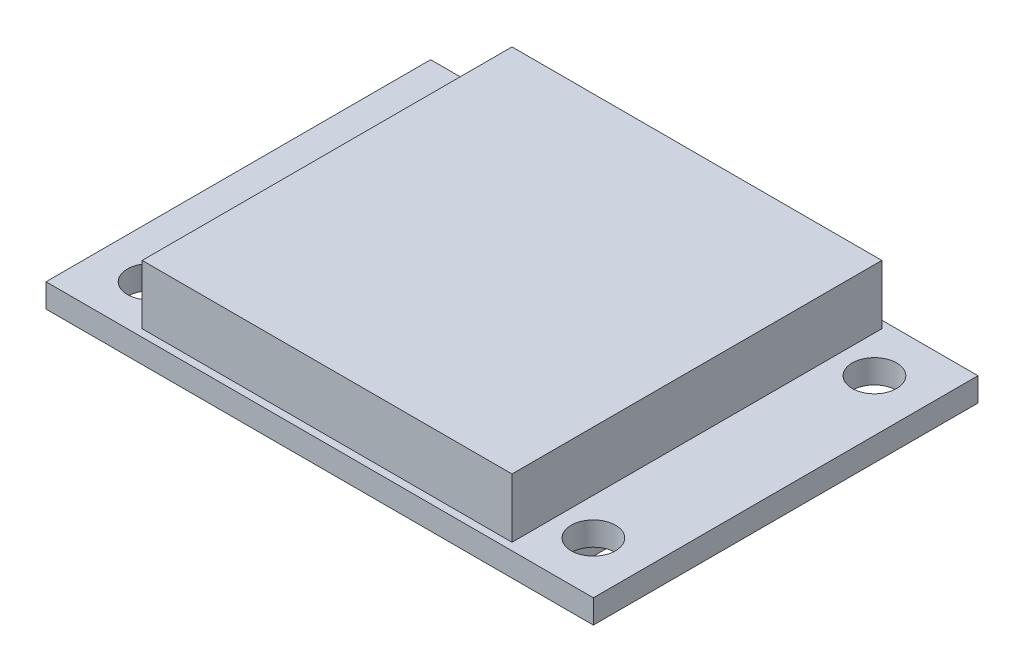
ISO-10303-21;
HEADER;
FILE_DESCRIPTION(('STEP AP214'),'2;1');
FILE_NAME('part.step','',(''),(''),'','','');
FILE_SCHEMA(('AUTOMOTIVE_DESIGN { 1 0 10303 214 1 1 1 1 }'));
ENDSEC;
DATA;
#1=APPLICATION_CONTEXT('core data for automotive mechanical design processes');
#2=APPLICATION_PROTOCOL_DEFINITION('international standard','automotive_design',2000,#1);
#3=PRODUCT_CONTEXT('',#1,'mechanical');
#4=PRODUCT('Part','Part','',(#3));
#5=PRODUCT_RELATED_PRODUCT_CATEGORY('part','',(#4));
#6=PRODUCT_DEFINITION_FORMATION('','',#4);
#7=PRODUCT_DEFINITION_CONTEXT('part definition',#1,'design');
#8=PRODUCT_DEFINITION('design','',#6,#7);
#9=PRODUCT_DEFINITION_SHAPE('','',#8);
#10=(LENGTH_UNIT() NAMED_UNIT(*) SI_UNIT(.MILLI.,.METRE.));
#11=(NAMED_UNIT(*) PLANE_ANGLE_UNIT() SI_UNIT($,.RADIAN.));
#12=(NAMED_UNIT(*) SI_UNIT($,.STERADIAN.) SOLID_ANGLE_UNIT());
#13=UNCERTAINTY_MEASURE_WITH_UNIT(LENGTH_MEASURE(1.E-05),#10,'distance_accuracy_value','');
#14=(GEOMETRIC_REPRESENTATION_CONTEXT(3) GLOBAL_UNCERTAINTY_ASSIGNED_CONTEXT((#13)) GLOBAL_UNIT_ASSIGNED_CONTEXT((#10,
#11,#12)) REPRESENTATION_CONTEXT('',''));
#15=CARTESIAN_POINT('',(0.,0.,0.));
#16=DIRECTION('',(0.,0.,1.));
#17=DIRECTION('',(1.,0.,0.));
#18=AXIS2_PLACEMENT_3D('',#15,#16,#17);
#19=CARTESIAN_POINT('',(0.,0.,0.));
#20=DIRECTION('',(0.,-1.,0.));
#21=DIRECTION('',(0.,0.,-1.));
#22=AXIS2_PLACEMENT_3D('',#19,#20,#21);
#23=PLANE('',#22);
#24=CARTESIAN_POINT('',(3.5,0.,-3.49999999999999));
#25=DIRECTION('',(0.,1.,0.));
#26=DIRECTION('',(0.,0.,-1.));
#27=AXIS2_PLACEMENT_3D('',#24,#25,#26);
#28=CIRCLE('',#27,1.5);
#29=CARTESIAN_POINT('',(3.5,0.,-4.99999999999999));
#30=VERTEX_POINT('',#29);
#31=EDGE_CURVE('E181',#30,#30,#28,.T.);
#32=ORIENTED_EDGE('',*,*,#31,.T.);
#33=EDGE_LOOP('',(#32));
#34=FACE_BOUND('',#33,.T.);
#35=CARTESIAN_POINT('',(33.5,0.,-22.5));
#36=DIRECTION('',(0.,1.,0.));
#37=DIRECTION('',(0.,0.,-1.));
#38=AXIS2_PLACEMENT_3D('',#35,#36,#37);
#39=CIRCLE('',#38,1.5);
#40=CARTESIAN_POINT('',(33.5,0.,-24.));
#41=VERTEX_POINT('',#40);
#42=EDGE_CURVE('E191',#41,#41,#39,.T.);
#43=ORIENTED_EDGE('',*,*,#42,.T.);
#44=EDGE_LOOP('',(#43));
#45=FACE_BOUND('',#44,.T.);
#46=DIRECTION('',(0.,0.,1.));
#47=VECTOR('',#46,1.);
#48=CARTESIAN_POINT('',(0.,0.,0.));
#49=LINE('',#48,#47);
#50=CARTESIAN_POINT('',(0.,0.,-26.));
#51=VERTEX_POINT('',#50);
#52=CARTESIAN_POINT('',(0.,0.,0.));
#53=VERTEX_POINT('',#52);
#54=EDGE_CURVE('E203',#51,#53,#49,.T.);
#55=ORIENTED_EDGE('',*,*,#54,.F.);
#56=DIRECTION('',(-1.,0.,0.));
#57=VECTOR('',#56,1.);
#58=CARTESIAN_POINT('',(0.,0.,-26.));
#59=LINE('',#58,#57);
#60=CARTESIAN_POINT('',(37.,0.,-26.));
#61=VERTEX_POINT('',#60);
#62=EDGE_CURVE('E210',#61,#51,#59,.T.);
#63=ORIENTED_EDGE('',*,*,#62,.F.);
#64=DIRECTION('',(0.,0.,-1.));
#65=VECTOR('',#64,1.);
#66=CARTESIAN_POINT('',(37.,0.,0.));
#67=LINE('',#66,#65);
#68=CARTESIAN_POINT('',(37.,0.,0.));
#69=VERTEX_POINT('',#68);
#70=EDGE_CURVE('E221',#69,#61,#67,.T.);
#71=ORIENTED_EDGE('',*,*,#70,.F.);
#72=DIRECTION('',(1.,0.,0.));
#73=VECTOR('',#72,1.);
#74=CARTESIAN_POINT('',(0.,0.,0.));
#75=LINE('',#74,#73);
#76=EDGE_CURVE('E219',#53,#69,#75,.T.);
#77=ORIENTED_EDGE('',*,*,#76,.F.);
#78=EDGE_LOOP('',(#55,#63,#71,#77));
#79=FACE_BOUND('',#78,.T.);
#80=CARTESIAN_POINT('',(3.5,0.,-22.5));
#81=DIRECTION('',(0.,1.,0.));
#82=DIRECTION('',(0.,0.,1.));
#83=AXIS2_PLACEMENT_3D('',#80,#81,#82);
#84=CIRCLE('',#83,1.5);
#85=CARTESIAN_POINT('',(3.5,0.,-21.));
#86=VERTEX_POINT('',#85);
#87=EDGE_CURVE('E197',#86,#86,#84,.T.);
#88=ORIENTED_EDGE('',*,*,#87,.T.);
#89=EDGE_LOOP('',(#88));
#90=FACE_BOUND('',#89,.T.);
#91=CARTESIAN_POINT('',(33.5,0.,-3.49999999999999));
#92=DIRECTION('',(0.,1.,0.));
#93=DIRECTION('',(0.,0.,1.));
#94=AXIS2_PLACEMENT_3D('',#91,#92,#93);
#95=CIRCLE('',#94,1.5);
#96=CARTESIAN_POINT('',(33.5,0.,-1.99999999999999));
#97=VERTEX_POINT('',#96);
#98=EDGE_CURVE('E185',#97,#97,#95,.T.);
#99=ORIENTED_EDGE('',*,*,#98,.T.);
#100=EDGE_LOOP('',(#99));
#101=FACE_BOUND('',#100,.T.);
#102=DIRECTION('',(1.,0.,0.));
#103=VECTOR('',#102,1.);
#104=CARTESIAN_POINT('',(30.5658466105143,0.,-21.));
#105=LINE('',#104,#103);
#106=CARTESIAN_POINT('',(18.5658466105143,0.,-21.));
#107=VERTEX_POINT('',#106);
#108=CARTESIAN_POINT('',(30.5658466105143,0.,-21.));
#109=VERTEX_POINT('',#108);
#110=EDGE_CURVE('E441',#107,#109,#105,.T.);
#111=ORIENTED_EDGE('',*,*,#110,.F.);
#112=DIRECTION('',(0.,0.,-1.));
#113=VECTOR('',#112,1.);
#114=CARTESIAN_POINT('',(18.5658466105143,0.,-21.));
#115=LINE('',#114,#113);
#116=CARTESIAN_POINT('',(18.5658466105143,0.,-5.));
#117=VERTEX_POINT('',#116);
#118=EDGE_CURVE('E145',#117,#107,#115,.T.);
#119=ORIENTED_EDGE('',*,*,#118,.F.);
#120=DIRECTION('',(-1.,0.,0.));
#121=VECTOR('',#120,1.);
#122=CARTESIAN_POINT('',(30.5658466105143,0.,-5.));
#123=LINE('',#122,#121);
#124=CARTESIAN_POINT('',(30.5658466105143,0.,-5.));
#125=VERTEX_POINT('',#124);
#126=EDGE_CURVE('E141',#125,#117,#123,.T.);
#127=ORIENTED_EDGE('',*,*,#126,.F.);
#128=DIRECTION('',(0.,0.,1.));
#129=VECTOR('',#128,1.);
#130=CARTESIAN_POINT('',(30.5658466105143,0.,-21.));
#131=LINE('',#130,#129);
#132=EDGE_CURVE('E438',#109,#125,#131,.T.);
#133=ORIENTED_EDGE('',*,*,#132,.F.);
#134=EDGE_LOOP('',(#111,#119,#127,#133));
#135=FACE_BOUND('',#134,.T.);
#136=ADVANCED_FACE('F33',(#34,#45,#79,#90,#101,#135),#23,.T.);
#137=CARTESIAN_POINT('',(0.,1.6,0.));
#138=DIRECTION('',(0.,-1.,0.));
#139=DIRECTION('',(0.,0.,-1.));
#140=AXIS2_PLACEMENT_3D('',#137,#138,#139);
#141=PLANE('',#140);
#142=CARTESIAN_POINT('',(3.5,1.6,-3.49999999999999));
#143=DIRECTION('',(0.,1.,0.));
#144=DIRECTION('',(0.,0.,-1.));
#145=AXIS2_PLACEMENT_3D('',#142,#143,#144);
#146=CIRCLE('',#145,1.5);
#147=CARTESIAN_POINT('',(3.5,1.6,-4.99999999999999));
#148=VERTEX_POINT('',#147);
#149=EDGE_CURVE('E182',#148,#148,#146,.T.);
#150=ORIENTED_EDGE('',*,*,#149,.F.);
#151=EDGE_LOOP('',(#150));
#152=FACE_BOUND('',#151,.T.);
#153=CARTESIAN_POINT('',(33.5,1.6,-22.5));
#154=DIRECTION('',(0.,1.,0.));
#155=DIRECTION('',(0.,0.,-1.));
#156=AXIS2_PLACEMENT_3D('',#153,#154,#155);
#157=CIRCLE('',#156,1.5);
#158=CARTESIAN_POINT('',(33.5,1.6,-24.));
#159=VERTEX_POINT('',#158);
#160=EDGE_CURVE('E194',#159,#159,#157,.T.);
#161=ORIENTED_EDGE('',*,*,#160,.F.);
#162=EDGE_LOOP('',(#161));
#163=FACE_BOUND('',#162,.T.);
#164=DIRECTION('',(0.,0.,1.));
#165=VECTOR('',#164,1.);
#166=CARTESIAN_POINT('',(0.,1.6,0.));
#167=LINE('',#166,#165);
#168=CARTESIAN_POINT('',(0.,1.6,-26.));
#169=VERTEX_POINT('',#168);
#170=CARTESIAN_POINT('',(0.,1.6,0.));
#171=VERTEX_POINT('',#170);
#172=EDGE_CURVE('E206',#169,#171,#167,.T.);
#173=ORIENTED_EDGE('',*,*,#172,.T.);
#174=DIRECTION('',(1.,0.,0.));
#175=VECTOR('',#174,1.);
#176=CARTESIAN_POINT('',(0.,1.6,0.));
#177=LINE('',#176,#175);
#178=CARTESIAN_POINT('',(37.,1.6,0.));
#179=VERTEX_POINT('',#178);
#180=EDGE_CURVE('E209',#171,#179,#177,.T.);
#181=ORIENTED_EDGE('',*,*,#180,.T.);
#182=DIRECTION('',(0.,0.,-1.));
#183=VECTOR('',#182,1.);
#184=CARTESIAN_POINT('',(37.,1.6,0.));
#185=LINE('',#184,#183);
#186=CARTESIAN_POINT('',(37.,1.6,-26.));
#187=VERTEX_POINT('',#186);
#188=EDGE_CURVE('E212',#179,#187,#185,.T.);
#189=ORIENTED_EDGE('',*,*,#188,.T.);
#190=DIRECTION('',(-1.,0.,0.));
#191=VECTOR('',#190,1.);
#192=CARTESIAN_POINT('',(0.,1.6,-26.));
#193=LINE('',#192,#191);
#194=EDGE_CURVE('E214',#187,#169,#193,.T.);
#195=ORIENTED_EDGE('',*,*,#194,.T.);
#196=EDGE_LOOP('',(#173,#181,#189,#195));
#197=FACE_BOUND('',#196,.T.);
#198=CARTESIAN_POINT('',(3.5,1.6,-22.5));
#199=DIRECTION('',(0.,1.,0.));
#200=DIRECTION('',(0.,0.,1.));
#201=AXIS2_PLACEMENT_3D('',#198,#199,#200);
#202=CIRCLE('',#201,1.5);
#203=CARTESIAN_POINT('',(3.5,1.6,-21.));
#204=VERTEX_POINT('',#203);
#205=EDGE_CURVE('E200',#204,#204,#202,.T.);
#206=ORIENTED_EDGE('',*,*,#205,.F.);
#207=EDGE_LOOP('',(#206));
#208=FACE_BOUND('',#207,.T.);
#209=CARTESIAN_POINT('',(33.5,1.6,-3.49999999999999));
#210=DIRECTION('',(0.,1.,0.));
#211=DIRECTION('',(0.,0.,1.));
#212=AXIS2_PLACEMENT_3D('',#209,#210,#211);
#213=CIRCLE('',#212,1.5);
#214=CARTESIAN_POINT('',(33.5,1.6,-1.99999999999999));
#215=VERTEX_POINT('',#214);
#216=EDGE_CURVE('E188',#215,#215,#213,.T.);
#217=ORIENTED_EDGE('',*,*,#216,.F.);
#218=EDGE_LOOP('',(#217));
#219=FACE_BOUND('',#218,.T.);
#220=DIRECTION('',(0.,0.,-1.));
#221=VECTOR('',#220,1.);
#222=CARTESIAN_POINT('',(31.,1.6,-0.500000000000006));
#223=LINE('',#222,#221);
#224=CARTESIAN_POINT('',(31.,1.6,-0.500000000000006));
#225=VERTEX_POINT('',#224);
#226=CARTESIAN_POINT('',(31.,1.6,-25.5));
#227=VERTEX_POINT('',#226);
#228=EDGE_CURVE('E147',#225,#227,#223,.T.);
#229=ORIENTED_EDGE('',*,*,#228,.F.);
#230=DIRECTION('',(1.,0.,0.));
#231=VECTOR('',#230,1.);
#232=CARTESIAN_POINT('',(6.,1.6,-0.500000000000006));
#233=LINE('',#232,#231);
#234=CARTESIAN_POINT('',(6.,1.6,-0.500000000000006));
#235=VERTEX_POINT('',#234);
#236=EDGE_CURVE('E158',#235,#225,#233,.T.);
#237=ORIENTED_EDGE('',*,*,#236,.F.);
#238=DIRECTION('',(0.,0.,1.));
#239=VECTOR('',#238,1.);
#240=CARTESIAN_POINT('',(6.,1.6,-0.500000000000006));
#241=LINE('',#240,#239);
#242=CARTESIAN_POINT('',(6.,1.6,-25.5));
#243=VERTEX_POINT('',#242);
#244=EDGE_CURVE('E166',#243,#235,#241,.T.);
#245=ORIENTED_EDGE('',*,*,#244,.F.);
#246=DIRECTION('',(-1.,0.,0.));
#247=VECTOR('',#246,1.);
#248=CARTESIAN_POINT('',(6.,1.6,-25.5));
#249=LINE('',#248,#247);
#250=EDGE_CURVE('E56',#227,#243,#249,.T.);
#251=ORIENTED_EDGE('',*,*,#250,.F.);
#252=EDGE_LOOP('',(#229,#237,#245,#251));
#253=FACE_BOUND('',#252,.T.);
#254=ADVANCED_FACE('F248',(#152,#163,#197,#208,#219,#253),#141,.F.);
#255=CARTESIAN_POINT('',(0.,1.6,0.));
#256=DIRECTION('',(1.,0.,0.));
#257=DIRECTION('',(0.,0.,-1.));
#258=AXIS2_PLACEMENT_3D('',#255,#256,#257);
#259=PLANE('',#258);
#260=ORIENTED_EDGE('',*,*,#54,.T.);
#261=DIRECTION('',(0.,-1.,0.));
#262=VECTOR('',#261,1.);
#263=CARTESIAN_POINT('',(0.,1.6,0.));
#264=LINE('',#263,#262);
#265=EDGE_CURVE('E11',#171,#53,#264,.T.);
#266=ORIENTED_EDGE('',*,*,#265,.F.);
#267=ORIENTED_EDGE('',*,*,#172,.F.);
#268=DIRECTION('',(0.,-1.,0.));
#269=VECTOR('',#268,1.);
#270=CARTESIAN_POINT('',(0.,1.6,-26.));
#271=LINE('',#270,#269);
#272=EDGE_CURVE('E216',#169,#51,#271,.T.);
#273=ORIENTED_EDGE('',*,*,#272,.T.);
#274=EDGE_LOOP('',(#260,#266,#267,#273));
#275=FACE_BOUND('',#274,.T.);
#276=ADVANCED_FACE('F35',(#275),#259,.F.);
#277=CARTESIAN_POINT('',(0.,1.6,0.));
#278=DIRECTION('',(0.,0.,-1.));
#279=DIRECTION('',(-1.,0.,0.));
#280=AXIS2_PLACEMENT_3D('',#277,#278,#279);
#281=PLANE('',#280);
#282=ORIENTED_EDGE('',*,*,#76,.T.);
#283=DIRECTION('',(0.,-1.,0.));
#284=VECTOR('',#283,1.);
#285=CARTESIAN_POINT('',(37.,1.6,0.));
#286=LINE('',#285,#284);
#287=EDGE_CURVE('E41',#179,#69,#286,.T.);
#288=ORIENTED_EDGE('',*,*,#287,.F.);
#289=ORIENTED_EDGE('',*,*,#180,.F.);
#290=ORIENTED_EDGE('',*,*,#265,.T.);
#291=EDGE_LOOP('',(#282,#288,#289,#290));
#292=FACE_BOUND('',#291,.T.);
#293=ADVANCED_FACE('F250',(#292),#281,.F.);
#294=CARTESIAN_POINT('',(37.,1.6,0.));
#295=DIRECTION('',(-1.,0.,0.));
#296=DIRECTION('',(0.,0.,1.));
#297=AXIS2_PLACEMENT_3D('',#294,#295,#296);
#298=PLANE('',#297);
#299=ORIENTED_EDGE('',*,*,#70,.T.);
#300=DIRECTION('',(0.,-1.,0.));
#301=VECTOR('',#300,1.);
#302=CARTESIAN_POINT('',(37.,1.6,-26.));
#303=LINE('',#302,#301);
#304=EDGE_CURVE('E226',#187,#61,#303,.T.);
#305=ORIENTED_EDGE('',*,*,#304,.F.);
#306=ORIENTED_EDGE('',*,*,#188,.F.);
#307=ORIENTED_EDGE('',*,*,#287,.T.);
#308=EDGE_LOOP('',(#299,#305,#306,#307));
#309=FACE_BOUND('',#308,.T.);
#310=ADVANCED_FACE('F233',(#309),#298,.F.);
#311=CARTESIAN_POINT('',(0.,1.6,-26.));
#312=DIRECTION('',(0.,0.,1.));
#313=DIRECTION('',(1.,0.,0.));
#314=AXIS2_PLACEMENT_3D('',#311,#312,#313);
#315=PLANE('',#314);
#316=ORIENTED_EDGE('',*,*,#62,.T.);
#317=ORIENTED_EDGE('',*,*,#272,.F.);
#318=ORIENTED_EDGE('',*,*,#194,.F.);
#319=ORIENTED_EDGE('',*,*,#304,.T.);
#320=EDGE_LOOP('',(#316,#317,#318,#319));
#321=FACE_BOUND('',#320,.T.);
#322=ADVANCED_FACE('F242',(#321),#315,.F.);
#323=CARTESIAN_POINT('',(3.5,1.6,-22.5));
#324=DIRECTION('',(0.,-1.,0.));
#325=DIRECTION('',(0.,0.,-1.));
#326=AXIS2_PLACEMENT_3D('',#323,#324,#325);
#327=CYLINDRICAL_SURFACE('',#326,1.5);
#328=ORIENTED_EDGE('',*,*,#205,.T.);
#329=EDGE_LOOP('',(#328));
#330=FACE_BOUND('',#329,.T.);
#331=ORIENTED_EDGE('',*,*,#87,.F.);
#332=EDGE_LOOP('',(#331));
#333=FACE_BOUND('',#332,.T.);
#334=ADVANCED_FACE('F269',(#330,#333),#327,.F.);
#335=CARTESIAN_POINT('',(33.5,1.6,-22.5));
#336=DIRECTION('',(0.,-1.,0.));
#337=DIRECTION('',(0.,0.,-1.));
#338=AXIS2_PLACEMENT_3D('',#335,#336,#337);
#339=CYLINDRICAL_SURFACE('',#338,1.5);
#340=ORIENTED_EDGE('',*,*,#160,.T.);
#341=EDGE_LOOP('',(#340));
#342=FACE_BOUND('',#341,.T.);
#343=ORIENTED_EDGE('',*,*,#42,.F.);
#344=EDGE_LOOP('',(#343));
#345=FACE_BOUND('',#344,.T.);
#346=ADVANCED_FACE('F273',(#342,#345),#339,.F.);
#347=CARTESIAN_POINT('',(33.5,1.6,-3.49999999999999));
#348=DIRECTION('',(0.,-1.,0.));
#349=DIRECTION('',(0.,0.,-1.));
#350=AXIS2_PLACEMENT_3D('',#347,#348,#349);
#351=CYLINDRICAL_SURFACE('',#350,1.5);
#352=ORIENTED_EDGE('',*,*,#216,.T.);
#353=EDGE_LOOP('',(#352));
#354=FACE_BOUND('',#353,.T.);
#355=ORIENTED_EDGE('',*,*,#98,.F.);
#356=EDGE_LOOP('',(#355));
#357=FACE_BOUND('',#356,.T.);
#358=ADVANCED_FACE('F278',(#354,#357),#351,.F.);
#359=CARTESIAN_POINT('',(3.5,1.6,-3.49999999999999));
#360=DIRECTION('',(0.,-1.,0.));
#361=DIRECTION('',(0.,0.,-1.));
#362=AXIS2_PLACEMENT_3D('',#359,#360,#361);
#363=CYLINDRICAL_SURFACE('',#362,1.5);
#364=ORIENTED_EDGE('',*,*,#149,.T.);
#365=EDGE_LOOP('',(#364));
#366=FACE_BOUND('',#365,.T.);
#367=ORIENTED_EDGE('',*,*,#31,.F.);
#368=EDGE_LOOP('',(#367));
#369=FACE_BOUND('',#368,.T.);
#370=ADVANCED_FACE('F285',(#366,#369),#363,.F.);
#371=CARTESIAN_POINT('',(31.,5.6,-0.500000000000006));
#372=DIRECTION('',(-1.,0.,0.));
#373=DIRECTION('',(0.,0.,1.));
#374=AXIS2_PLACEMENT_3D('',#371,#372,#373);
#375=PLANE('',#374);
#376=ORIENTED_EDGE('',*,*,#228,.T.);
#377=DIRECTION('',(0.,-1.,0.));
#378=VECTOR('',#377,1.);
#379=CARTESIAN_POINT('',(31.,5.6,-25.5));
#380=LINE('',#379,#378);
#381=CARTESIAN_POINT('',(31.,5.6,-25.5));
#382=VERTEX_POINT('',#381);
#383=EDGE_CURVE('E179',#382,#227,#380,.T.);
#384=ORIENTED_EDGE('',*,*,#383,.F.);
#385=DIRECTION('',(0.,0.,-1.));
#386=VECTOR('',#385,1.);
#387=CARTESIAN_POINT('',(31.,5.6,-0.500000000000006));
#388=LINE('',#387,#386);
#389=CARTESIAN_POINT('',(31.,5.6,-0.500000000000006));
#390=VERTEX_POINT('',#389);
#391=EDGE_CURVE('E154',#390,#382,#388,.T.);
#392=ORIENTED_EDGE('',*,*,#391,.F.);
#393=DIRECTION('',(0.,-1.,0.));
#394=VECTOR('',#393,1.);
#395=CARTESIAN_POINT('',(31.,5.6,-0.500000000000006));
#396=LINE('',#395,#394);
#397=EDGE_CURVE('E163',#390,#225,#396,.T.);
#398=ORIENTED_EDGE('',*,*,#397,.T.);
#399=EDGE_LOOP('',(#376,#384,#392,#398));
#400=FACE_BOUND('',#399,.T.);
#401=ADVANCED_FACE('F289',(#400),#375,.F.);
#402=CARTESIAN_POINT('',(6.,5.6,-25.5));
#403=DIRECTION('',(0.,0.,1.));
#404=DIRECTION('',(1.,0.,0.));
#405=AXIS2_PLACEMENT_3D('',#402,#403,#404);
#406=PLANE('',#405);
#407=ORIENTED_EDGE('',*,*,#250,.T.);
#408=DIRECTION('',(0.,-1.,0.));
#409=VECTOR('',#408,1.);
#410=CARTESIAN_POINT('',(6.,5.6,-25.5));
#411=LINE('',#410,#409);
#412=CARTESIAN_POINT('',(6.,5.6,-25.5));
#413=VERTEX_POINT('',#412);
#414=EDGE_CURVE('E176',#413,#243,#411,.T.);
#415=ORIENTED_EDGE('',*,*,#414,.F.);
#416=DIRECTION('',(-1.,0.,0.));
#417=VECTOR('',#416,1.);
#418=CARTESIAN_POINT('',(6.,5.6,-25.5));
#419=LINE('',#418,#417);
#420=EDGE_CURVE('E157',#382,#413,#419,.T.);
#421=ORIENTED_EDGE('',*,*,#420,.F.);
#422=ORIENTED_EDGE('',*,*,#383,.T.);
#423=EDGE_LOOP('',(#407,#415,#421,#422));
#424=FACE_BOUND('',#423,.T.);
#425=ADVANCED_FACE('F293',(#424),#406,.F.);
#426=CARTESIAN_POINT('',(6.,5.6,-0.500000000000006));
#427=DIRECTION('',(1.,0.,0.));
#428=DIRECTION('',(0.,0.,-1.));
#429=AXIS2_PLACEMENT_3D('',#426,#427,#428);
#430=PLANE('',#429);
#431=ORIENTED_EDGE('',*,*,#244,.T.);
#432=DIRECTION('',(0.,-1.,0.));
#433=VECTOR('',#432,1.);
#434=CARTESIAN_POINT('',(6.,5.6,-0.500000000000006));
#435=LINE('',#434,#433);
#436=CARTESIAN_POINT('',(6.,5.6,-0.500000000000006));
#437=VERTEX_POINT('',#436);
#438=EDGE_CURVE('E173',#437,#235,#435,.T.);
#439=ORIENTED_EDGE('',*,*,#438,.F.);
#440=DIRECTION('',(0.,0.,1.));
#441=VECTOR('',#440,1.);
#442=CARTESIAN_POINT('',(6.,5.6,-0.500000000000006));
#443=LINE('',#442,#441);
#444=EDGE_CURVE('E160',#413,#437,#443,.T.);
#445=ORIENTED_EDGE('',*,*,#444,.F.);
#446=ORIENTED_EDGE('',*,*,#414,.T.);
#447=EDGE_LOOP('',(#431,#439,#445,#446));
#448=FACE_BOUND('',#447,.T.);
#449=ADVANCED_FACE('F297',(#448),#430,.F.);
#450=CARTESIAN_POINT('',(6.,5.6,-0.500000000000006));
#451=DIRECTION('',(0.,0.,-1.));
#452=DIRECTION('',(-1.,0.,0.));
#453=AXIS2_PLACEMENT_3D('',#450,#451,#452);
#454=PLANE('',#453);
#455=ORIENTED_EDGE('',*,*,#236,.T.);
#456=ORIENTED_EDGE('',*,*,#397,.F.);
#457=DIRECTION('',(1.,0.,0.));
#458=VECTOR('',#457,1.);
#459=CARTESIAN_POINT('',(6.,5.6,-0.500000000000006));
#460=LINE('',#459,#458);
#461=EDGE_CURVE('E162',#437,#390,#460,.T.);
#462=ORIENTED_EDGE('',*,*,#461,.F.);
#463=ORIENTED_EDGE('',*,*,#438,.T.);
#464=EDGE_LOOP('',(#455,#456,#462,#463));
#465=FACE_BOUND('',#464,.T.);
#466=ADVANCED_FACE('F301',(#465),#454,.F.);
#467=CARTESIAN_POINT('',(0.,5.6,0.));
#468=DIRECTION('',(0.,-1.,0.));
#469=DIRECTION('',(0.,0.,-1.));
#470=AXIS2_PLACEMENT_3D('',#467,#468,#469);
#471=PLANE('',#470);
#472=ORIENTED_EDGE('',*,*,#391,.T.);
#473=ORIENTED_EDGE('',*,*,#420,.T.);
#474=ORIENTED_EDGE('',*,*,#444,.T.);
#475=ORIENTED_EDGE('',*,*,#461,.T.);
#476=EDGE_LOOP('',(#472,#473,#474,#475));
#477=FACE_BOUND('',#476,.T.);
#478=ADVANCED_FACE('F305',(#477),#471,.F.);
#479=CARTESIAN_POINT('',(18.5658466105143,-2.4,-21.));
#480=DIRECTION('',(1.,0.,0.));
#481=DIRECTION('',(0.,0.,-1.));
#482=AXIS2_PLACEMENT_3D('',#479,#480,#481);
#483=PLANE('',#482);
#484=ORIENTED_EDGE('',*,*,#118,.T.);
#485=DIRECTION('',(0.,1.,0.));
#486=VECTOR('',#485,1.);
#487=CARTESIAN_POINT('',(18.5658466105143,-2.4,-21.));
#488=LINE('',#487,#486);
#489=CARTESIAN_POINT('',(18.5658466105143,-2.4,-21.));
#490=VERTEX_POINT('',#489);
#491=EDGE_CURVE('E126',#490,#107,#488,.T.);
#492=ORIENTED_EDGE('',*,*,#491,.F.);
#493=DIRECTION('',(0.,0.,-1.));
#494=VECTOR('',#493,1.);
#495=CARTESIAN_POINT('',(18.5658466105143,-2.4,-21.));
#496=LINE('',#495,#494);
#497=CARTESIAN_POINT('',(18.5658466105143,-2.4,-5.));
#498=VERTEX_POINT('',#497);
#499=EDGE_CURVE('E133',#498,#490,#496,.T.);
#500=ORIENTED_EDGE('',*,*,#499,.F.);
#501=DIRECTION('',(0.,1.,0.));
#502=VECTOR('',#501,1.);
#503=CARTESIAN_POINT('',(18.5658466105143,-2.4,-5.));
#504=LINE('',#503,#502);
#505=EDGE_CURVE('E435',#498,#117,#504,.T.);
#506=ORIENTED_EDGE('',*,*,#505,.T.);
#507=EDGE_LOOP('',(#484,#492,#500,#506));
#508=FACE_BOUND('',#507,.T.);
#509=ADVANCED_FACE('F143',(#508),#483,.F.);
#510=CARTESIAN_POINT('',(30.5658466105143,-2.4,-21.));
#511=DIRECTION('',(0.,0.,1.));
#512=DIRECTION('',(1.,0.,0.));
#513=AXIS2_PLACEMENT_3D('',#510,#511,#512);
#514=PLANE('',#513);
#515=ORIENTED_EDGE('',*,*,#110,.T.);
#516=DIRECTION('',(0.,1.,0.));
#517=VECTOR('',#516,1.);
#518=CARTESIAN_POINT('',(30.5658466105143,-2.4,-21.));
#519=LINE('',#518,#517);
#520=CARTESIAN_POINT('',(30.5658466105143,-2.4,-21.));
#521=VERTEX_POINT('',#520);
#522=EDGE_CURVE('E129',#521,#109,#519,.T.);
#523=ORIENTED_EDGE('',*,*,#522,.F.);
#524=DIRECTION('',(1.,0.,0.));
#525=VECTOR('',#524,1.);
#526=CARTESIAN_POINT('',(30.5658466105143,-2.4,-21.));
#527=LINE('',#526,#525);
#528=EDGE_CURVE('E122',#490,#521,#527,.T.);
#529=ORIENTED_EDGE('',*,*,#528,.F.);
#530=ORIENTED_EDGE('',*,*,#491,.T.);
#531=EDGE_LOOP('',(#515,#523,#529,#530));
#532=FACE_BOUND('',#531,.T.);
#533=ADVANCED_FACE('F124',(#532),#514,.F.);
#534=CARTESIAN_POINT('',(30.5658466105143,-2.4,-21.));
#535=DIRECTION('',(-1.,0.,0.));
#536=DIRECTION('',(0.,0.,1.));
#537=AXIS2_PLACEMENT_3D('',#534,#535,#536);
#538=PLANE('',#537);
#539=ORIENTED_EDGE('',*,*,#132,.T.);
#540=DIRECTION('',(0.,1.,0.));
#541=VECTOR('',#540,1.);
#542=CARTESIAN_POINT('',(30.5658466105143,-2.4,-5.));
#543=LINE('',#542,#541);
#544=CARTESIAN_POINT('',(30.5658466105143,-2.4,-5.));
#545=VERTEX_POINT('',#544);
#546=EDGE_CURVE('E48',#545,#125,#543,.T.);
#547=ORIENTED_EDGE('',*,*,#546,.F.);
#548=DIRECTION('',(0.,0.,1.));
#549=VECTOR('',#548,1.);
#550=CARTESIAN_POINT('',(30.5658466105143,-2.4,-21.));
#551=LINE('',#550,#549);
#552=EDGE_CURVE('E132',#521,#545,#551,.T.);
#553=ORIENTED_EDGE('',*,*,#552,.F.);
#554=ORIENTED_EDGE('',*,*,#522,.T.);
#555=EDGE_LOOP('',(#539,#547,#553,#554));
#556=FACE_BOUND('',#555,.T.);
#557=ADVANCED_FACE('F314',(#556),#538,.F.);
#558=CARTESIAN_POINT('',(30.5658466105143,-2.4,-5.));
#559=DIRECTION('',(0.,0.,-1.));
#560=DIRECTION('',(-1.,0.,0.));
#561=AXIS2_PLACEMENT_3D('',#558,#559,#560);
#562=PLANE('',#561);
#563=ORIENTED_EDGE('',*,*,#126,.T.);
#564=ORIENTED_EDGE('',*,*,#505,.F.);
#565=DIRECTION('',(-1.,0.,0.));
#566=VECTOR('',#565,1.);
#567=CARTESIAN_POINT('',(30.5658466105143,-2.4,-5.));
#568=LINE('',#567,#566);
#569=EDGE_CURVE('E137',#545,#498,#568,.T.);
#570=ORIENTED_EDGE('',*,*,#569,.F.);
#571=ORIENTED_EDGE('',*,*,#546,.T.);
#572=EDGE_LOOP('',(#563,#564,#570,#571));
#573=FACE_BOUND('',#572,.T.);
#574=ADVANCED_FACE('F317',(#573),#562,.F.);
#575=CARTESIAN_POINT('',(0.,-2.4,0.));
#576=DIRECTION('',(0.,-1.,0.));
#577=DIRECTION('',(0.,0.,-1.));
#578=AXIS2_PLACEMENT_3D('',#575,#576,#577);
#579=PLANE('',#578);
#580=ORIENTED_EDGE('',*,*,#499,.T.);
#581=ORIENTED_EDGE('',*,*,#528,.T.);
#582=ORIENTED_EDGE('',*,*,#552,.T.);
#583=ORIENTED_EDGE('',*,*,#569,.T.);
#584=EDGE_LOOP('',(#580,#581,#582,#583));
#585=FACE_BOUND('',#584,.T.);
#586=ADVANCED_FACE('F136',(#585),#579,.T.);
#587=CLOSED_SHELL('',(#136,#254,#276,#293,#310,#322,#334,#346,#358,#370,#401,#425,#449,#466,
#478,#509,#533,#557,#574,#586));
#588=MANIFOLD_SOLID_BREP('B2',#587);
#589=ADVANCED_BREP_SHAPE_REPRESENTATION('',(#18,#588),#14);
#590=SHAPE_DEFINITION_REPRESENTATION(#9,#589);
ENDSEC;
END-ISO-10303-21;
